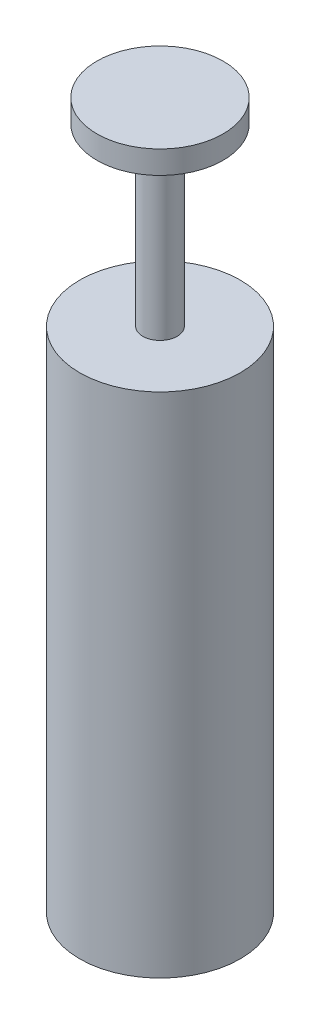
ISO-10303-21;
HEADER;
FILE_DESCRIPTION(('STEP AP214'),'2;1');
FILE_NAME('part.step','',(''),(''),'','','');
FILE_SCHEMA(('AUTOMOTIVE_DESIGN { 1 0 10303 214 1 1 1 1 }'));
ENDSEC;
DATA;
#1=APPLICATION_CONTEXT('core data for automotive mechanical design processes');
#2=APPLICATION_PROTOCOL_DEFINITION('international standard','automotive_design',2000,#1);
#3=PRODUCT_CONTEXT('',#1,'mechanical');
#4=PRODUCT('Part','Part','',(#3));
#5=PRODUCT_RELATED_PRODUCT_CATEGORY('part','',(#4));
#6=PRODUCT_DEFINITION_FORMATION('','',#4);
#7=PRODUCT_DEFINITION_CONTEXT('part definition',#1,'design');
#8=PRODUCT_DEFINITION('design','',#6,#7);
#9=PRODUCT_DEFINITION_SHAPE('','',#8);
#10=(LENGTH_UNIT() NAMED_UNIT(*) SI_UNIT(.MILLI.,.METRE.));
#11=(NAMED_UNIT(*) PLANE_ANGLE_UNIT() SI_UNIT($,.RADIAN.));
#12=(NAMED_UNIT(*) SI_UNIT($,.STERADIAN.) SOLID_ANGLE_UNIT());
#13=UNCERTAINTY_MEASURE_WITH_UNIT(LENGTH_MEASURE(1.E-05),#10,'distance_accuracy_value','');
#14=(GEOMETRIC_REPRESENTATION_CONTEXT(3) GLOBAL_UNCERTAINTY_ASSIGNED_CONTEXT((#13)) GLOBAL_UNIT_ASSIGNED_CONTEXT((#10,
#11,#12)) REPRESENTATION_CONTEXT('',''));
#15=CARTESIAN_POINT('',(0.,0.,0.));
#16=DIRECTION('',(0.,0.,1.));
#17=DIRECTION('',(1.,0.,0.));
#18=AXIS2_PLACEMENT_3D('',#15,#16,#17);
#19=CARTESIAN_POINT('',(0.,195.326,0.));
#20=DIRECTION('',(0.,1.,0.));
#21=DIRECTION('',(0.,0.,1.));
#22=AXIS2_PLACEMENT_3D('',#19,#20,#21);
#23=PLANE('',#22);
#24=CARTESIAN_POINT('',(0.,195.326,0.));
#25=DIRECTION('',(0.,-1.,0.));
#26=DIRECTION('',(0.,0.,-1.));
#27=AXIS2_PLACEMENT_3D('',#24,#25,#26);
#28=CIRCLE('',#27,17.4625);
#29=CARTESIAN_POINT('',(0.,195.326,-17.4625));
#30=VERTEX_POINT('',#29);
#31=EDGE_CURVE('E10',#30,#30,#28,.T.);
#32=ORIENTED_EDGE('',*,*,#31,.F.);
#33=EDGE_LOOP('',(#32));
#34=FACE_BOUND('',#33,.T.);
#35=ADVANCED_FACE('F29',(#34),#23,.T.);
#36=CARTESIAN_POINT('',(0.,0.,0.));
#37=DIRECTION('',(0.,-1.,0.));
#38=DIRECTION('',(0.,0.,-1.));
#39=AXIS2_PLACEMENT_3D('',#36,#37,#38);
#40=CYLINDRICAL_SURFACE('',#39,17.4625);
#41=ORIENTED_EDGE('',*,*,#31,.T.);
#42=EDGE_LOOP('',(#41));
#43=FACE_BOUND('',#42,.T.);
#44=CARTESIAN_POINT('',(0.,188.976,0.));
#45=DIRECTION('',(0.,-1.,0.));
#46=DIRECTION('',(0.,0.,-1.));
#47=AXIS2_PLACEMENT_3D('',#44,#45,#46);
#48=CIRCLE('',#47,17.4625);
#49=CARTESIAN_POINT('',(0.,188.976,-17.4625));
#50=VERTEX_POINT('',#49);
#51=EDGE_CURVE('E35',#50,#50,#48,.T.);
#52=ORIENTED_EDGE('',*,*,#51,.F.);
#53=EDGE_LOOP('',(#52));
#54=FACE_BOUND('',#53,.T.);
#55=ADVANCED_FACE('F71',(#43,#54),#40,.T.);
#56=CARTESIAN_POINT('',(0.,188.976,-17.4625));
#57=DIRECTION('',(0.,-1.,0.));
#58=DIRECTION('',(0.,0.,-1.));
#59=AXIS2_PLACEMENT_3D('',#56,#57,#58);
#60=PLANE('',#59);
#61=ORIENTED_EDGE('',*,*,#51,.T.);
#62=EDGE_LOOP('',(#61));
#63=FACE_BOUND('',#62,.T.);
#64=CARTESIAN_POINT('',(0.,188.976,0.));
#65=DIRECTION('',(0.,-1.,0.));
#66=DIRECTION('',(0.,0.,-1.));
#67=AXIS2_PLACEMENT_3D('',#64,#65,#66);
#68=CIRCLE('',#67,4.7625);
#69=CARTESIAN_POINT('',(0.,188.976,-4.7625));
#70=VERTEX_POINT('',#69);
#71=EDGE_CURVE('E39',#70,#70,#68,.T.);
#72=ORIENTED_EDGE('',*,*,#71,.F.);
#73=EDGE_LOOP('',(#72));
#74=FACE_BOUND('',#73,.T.);
#75=ADVANCED_FACE('F76',(#63,#74),#60,.T.);
#76=CARTESIAN_POINT('',(0.,0.,0.));
#77=DIRECTION('',(0.,-1.,0.));
#78=DIRECTION('',(0.,0.,-1.));
#79=AXIS2_PLACEMENT_3D('',#76,#77,#78);
#80=CYLINDRICAL_SURFACE('',#79,4.7625);
#81=ORIENTED_EDGE('',*,*,#71,.T.);
#82=EDGE_LOOP('',(#81));
#83=FACE_BOUND('',#82,.T.);
#84=CARTESIAN_POINT('',(0.,140.462,0.));
#85=DIRECTION('',(0.,-1.,0.));
#86=DIRECTION('',(0.,0.,-1.));
#87=AXIS2_PLACEMENT_3D('',#84,#85,#86);
#88=CIRCLE('',#87,4.76250000000001);
#89=CARTESIAN_POINT('',(0.,140.462,-4.76250000000001));
#90=VERTEX_POINT('',#89);
#91=EDGE_CURVE('E43',#90,#90,#88,.T.);
#92=ORIENTED_EDGE('',*,*,#91,.F.);
#93=EDGE_LOOP('',(#92));
#94=FACE_BOUND('',#93,.T.);
#95=ADVANCED_FACE('F67',(#83,#94),#80,.T.);
#96=CARTESIAN_POINT('',(0.,140.462,-4.76250000000001));
#97=DIRECTION('',(0.,1.,0.));
#98=DIRECTION('',(0.,0.,1.));
#99=AXIS2_PLACEMENT_3D('',#96,#97,#98);
#100=PLANE('',#99);
#101=ORIENTED_EDGE('',*,*,#91,.T.);
#102=EDGE_LOOP('',(#101));
#103=FACE_BOUND('',#102,.T.);
#104=CARTESIAN_POINT('',(0.,140.462,0.));
#105=DIRECTION('',(0.,-1.,0.));
#106=DIRECTION('',(0.,0.,-1.));
#107=AXIS2_PLACEMENT_3D('',#104,#105,#106);
#108=CIRCLE('',#107,22.225);
#109=CARTESIAN_POINT('',(0.,140.462,-22.225));
#110=VERTEX_POINT('',#109);
#111=EDGE_CURVE('E48',#110,#110,#108,.T.);
#112=ORIENTED_EDGE('',*,*,#111,.F.);
#113=EDGE_LOOP('',(#112));
#114=FACE_BOUND('',#113,.T.);
#115=ADVANCED_FACE('F59',(#103,#114),#100,.T.);
#116=CARTESIAN_POINT('',(0.,0.,0.));
#117=DIRECTION('',(0.,-1.,0.));
#118=DIRECTION('',(0.,0.,-1.));
#119=AXIS2_PLACEMENT_3D('',#116,#117,#118);
#120=CYLINDRICAL_SURFACE('',#119,22.225);
#121=ORIENTED_EDGE('',*,*,#111,.T.);
#122=EDGE_LOOP('',(#121));
#123=FACE_BOUND('',#122,.T.);
#124=CARTESIAN_POINT('',(0.,0.,0.));
#125=DIRECTION('',(0.,-1.,0.));
#126=DIRECTION('',(0.,0.,-1.));
#127=AXIS2_PLACEMENT_3D('',#124,#125,#126);
#128=CIRCLE('',#127,22.225);
#129=CARTESIAN_POINT('',(0.,0.,-22.225));
#130=VERTEX_POINT('',#129);
#131=EDGE_CURVE('E51',#130,#130,#128,.T.);
#132=ORIENTED_EDGE('',*,*,#131,.F.);
#133=EDGE_LOOP('',(#132));
#134=FACE_BOUND('',#133,.T.);
#135=ADVANCED_FACE('F57',(#123,#134),#120,.T.);
#136=CARTESIAN_POINT('',(0.,0.,-22.225));
#137=DIRECTION('',(0.,-1.,0.));
#138=DIRECTION('',(0.,0.,-1.));
#139=AXIS2_PLACEMENT_3D('',#136,#137,#138);
#140=PLANE('',#139);
#141=ORIENTED_EDGE('',*,*,#131,.T.);
#142=EDGE_LOOP('',(#141));
#143=FACE_BOUND('',#142,.T.);
#144=ADVANCED_FACE('F55',(#143),#140,.T.);
#145=CLOSED_SHELL('',(#35,#55,#75,#95,#115,#135,#144));
#146=MANIFOLD_SOLID_BREP('B2',#145);
#147=ADVANCED_BREP_SHAPE_REPRESENTATION('',(#18,#146),#14);
#148=SHAPE_DEFINITION_REPRESENTATION(#9,#147);
ENDSEC;
END-ISO-10303-21;
